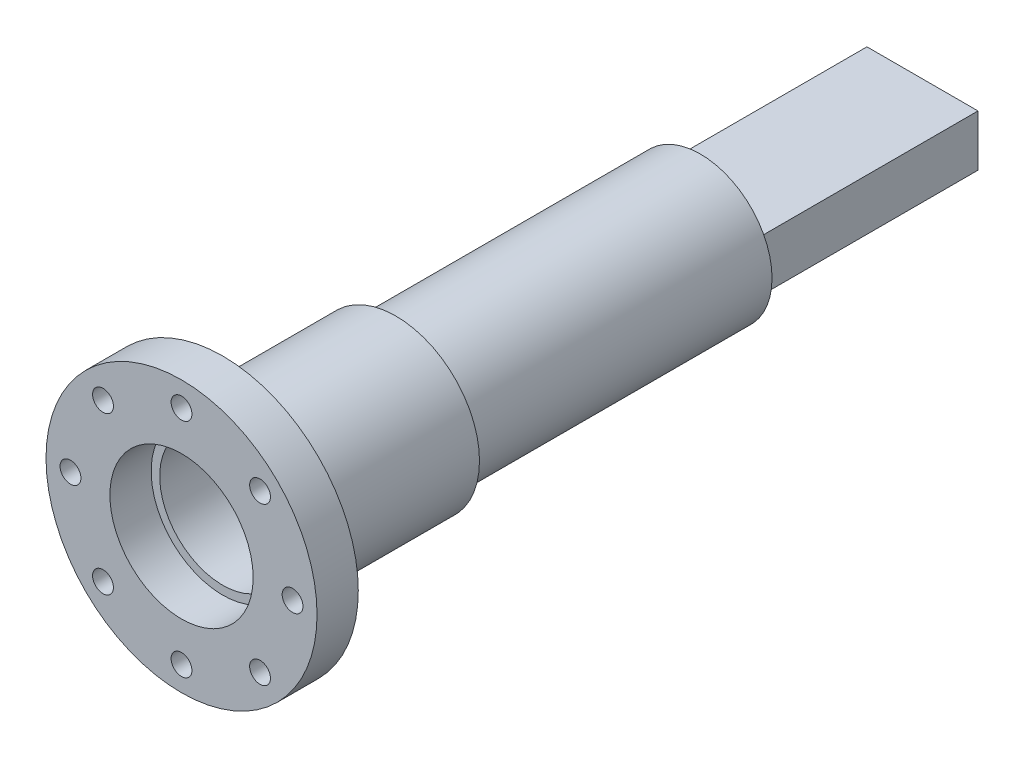
ISO-10303-21;
HEADER;
FILE_DESCRIPTION(('STEP AP214'),'2;1');
FILE_NAME('part.step','',(''),(''),'','','');
FILE_SCHEMA(('AUTOMOTIVE_DESIGN { 1 0 10303 214 1 1 1 1 }'));
ENDSEC;
DATA;
#1=APPLICATION_CONTEXT('core data for automotive mechanical design processes');
#2=APPLICATION_PROTOCOL_DEFINITION('international standard','automotive_design',2000,#1);
#3=PRODUCT_CONTEXT('',#1,'mechanical');
#4=PRODUCT('Part','Part','',(#3));
#5=PRODUCT_RELATED_PRODUCT_CATEGORY('part','',(#4));
#6=PRODUCT_DEFINITION_FORMATION('','',#4);
#7=PRODUCT_DEFINITION_CONTEXT('part definition',#1,'design');
#8=PRODUCT_DEFINITION('design','',#6,#7);
#9=PRODUCT_DEFINITION_SHAPE('','',#8);
#10=(LENGTH_UNIT() NAMED_UNIT(*) SI_UNIT(.MILLI.,.METRE.));
#11=(NAMED_UNIT(*) PLANE_ANGLE_UNIT() SI_UNIT($,.RADIAN.));
#12=(NAMED_UNIT(*) SI_UNIT($,.STERADIAN.) SOLID_ANGLE_UNIT());
#13=UNCERTAINTY_MEASURE_WITH_UNIT(LENGTH_MEASURE(1.E-05),#10,'distance_accuracy_value','');
#14=(GEOMETRIC_REPRESENTATION_CONTEXT(3) GLOBAL_UNCERTAINTY_ASSIGNED_CONTEXT((#13)) GLOBAL_UNIT_ASSIGNED_CONTEXT((#10,
#11,#12)) REPRESENTATION_CONTEXT('',''));
#15=CARTESIAN_POINT('',(0.,0.,0.));
#16=DIRECTION('',(0.,0.,1.));
#17=DIRECTION('',(1.,0.,0.));
#18=AXIS2_PLACEMENT_3D('',#15,#16,#17);
#19=CARTESIAN_POINT('',(0.,0.,217.27177272));
#20=DIRECTION('',(0.,0.,1.));
#21=DIRECTION('',(1.,0.,0.));
#22=AXIS2_PLACEMENT_3D('',#19,#20,#21);
#23=PLANE('',#22);
#24=CARTESIAN_POINT('',(-46.5000340000002,1.53523027623947E-13,217.27177272));
#25=DIRECTION('',(0.,0.,1.));
#26=DIRECTION('',(1.,0.,0.));
#27=AXIS2_PLACEMENT_3D('',#24,#25,#26);
#28=CIRCLE('',#27,4.36250097915163);
#29=CARTESIAN_POINT('',(-42.1375330208485,1.53523027623947E-13,217.27177272));
#30=VERTEX_POINT('',#29);
#31=EDGE_CURVE('E118',#30,#30,#28,.T.);
#32=ORIENTED_EDGE('',*,*,#31,.F.);
#33=EDGE_LOOP('',(#32));
#34=FACE_BOUND('',#33,.T.);
#35=CARTESIAN_POINT('',(-3.22457120133702E-13,-46.500034,217.27177272));
#36=DIRECTION('',(0.,0.,1.));
#37=DIRECTION('',(1.,0.,0.));
#38=AXIS2_PLACEMENT_3D('',#35,#36,#37);
#39=CIRCLE('',#38,4.36250097915163);
#40=CARTESIAN_POINT('',(4.36250097915131,-46.500034,217.27177272));
#41=VERTEX_POINT('',#40);
#42=EDGE_CURVE('E106',#41,#41,#39,.T.);
#43=ORIENTED_EDGE('',*,*,#42,.F.);
#44=EDGE_LOOP('',(#43));
#45=FACE_BOUND('',#44,.T.);
#46=CARTESIAN_POINT('',(46.5000339999998,-1.59160878920872E-13,217.27177272));
#47=DIRECTION('',(0.,0.,1.));
#48=DIRECTION('',(1.,0.,0.));
#49=AXIS2_PLACEMENT_3D('',#46,#47,#48);
#50=CIRCLE('',#49,4.36250097915163);
#51=CARTESIAN_POINT('',(50.8625349791515,-1.59160878920872E-13,217.27177272));
#52=VERTEX_POINT('',#51);
#53=EDGE_CURVE('E94',#52,#52,#50,.T.);
#54=ORIENTED_EDGE('',*,*,#53,.F.);
#55=EDGE_LOOP('',(#54));
#56=FACE_BOUND('',#55,.T.);
#57=CARTESIAN_POINT('',(0.,0.,217.27177272));
#58=DIRECTION('',(0.,0.,1.));
#59=DIRECTION('',(1.,0.,0.));
#60=AXIS2_PLACEMENT_3D('',#57,#58,#59);
#61=CIRCLE('',#60,29.99994);
#62=CARTESIAN_POINT('',(29.99994,0.,217.27177272));
#63=VERTEX_POINT('',#62);
#64=EDGE_CURVE('E82',#63,#63,#61,.T.);
#65=ORIENTED_EDGE('',*,*,#64,.F.);
#66=EDGE_LOOP('',(#65));
#67=FACE_BOUND('',#66,.T.);
#68=CARTESIAN_POINT('',(0.,0.,217.27177272));
#69=DIRECTION('',(0.,0.,1.));
#70=DIRECTION('',(1.,0.,0.));
#71=AXIS2_PLACEMENT_3D('',#68,#69,#70);
#72=CIRCLE('',#71,56.74999953);
#73=CARTESIAN_POINT('',(56.74999953,0.,217.27177272));
#74=VERTEX_POINT('',#73);
#75=EDGE_CURVE('E68',#74,#74,#72,.T.);
#76=ORIENTED_EDGE('',*,*,#75,.T.);
#77=EDGE_LOOP('',(#76));
#78=FACE_BOUND('',#77,.T.);
#79=CARTESIAN_POINT('',(0.,46.500034,217.27177272));
#80=DIRECTION('',(0.,0.,1.));
#81=DIRECTION('',(1.,0.,0.));
#82=AXIS2_PLACEMENT_3D('',#79,#80,#81);
#83=CIRCLE('',#82,4.36250097915163);
#84=CARTESIAN_POINT('',(4.36250097915163,46.500034,217.27177272));
#85=VERTEX_POINT('',#84);
#86=EDGE_CURVE('E77',#85,#85,#83,.T.);
#87=ORIENTED_EDGE('',*,*,#86,.F.);
#88=EDGE_LOOP('',(#87));
#89=FACE_BOUND('',#88,.T.);
#90=CARTESIAN_POINT('',(32.880489366805,32.8804893668049,217.27177272));
#91=DIRECTION('',(0.,0.,1.));
#92=DIRECTION('',(1.,0.,0.));
#93=AXIS2_PLACEMENT_3D('',#90,#91,#92);
#94=CIRCLE('',#93,4.36250097915163);
#95=CARTESIAN_POINT('',(37.2429903459566,32.8804893668049,217.27177272));
#96=VERTEX_POINT('',#95);
#97=EDGE_CURVE('E88',#96,#96,#94,.T.);
#98=ORIENTED_EDGE('',*,*,#97,.F.);
#99=EDGE_LOOP('',(#98));
#100=FACE_BOUND('',#99,.T.);
#101=CARTESIAN_POINT('',(32.8804893668047,-32.8804893668051,217.27177272));
#102=DIRECTION('',(0.,0.,1.));
#103=DIRECTION('',(1.,0.,0.));
#104=AXIS2_PLACEMENT_3D('',#101,#102,#103);
#105=CIRCLE('',#104,4.36250097915163);
#106=CARTESIAN_POINT('',(37.2429903459564,-32.8804893668051,217.27177272));
#107=VERTEX_POINT('',#106);
#108=EDGE_CURVE('E100',#107,#107,#105,.T.);
#109=ORIENTED_EDGE('',*,*,#108,.F.);
#110=EDGE_LOOP('',(#109));
#111=FACE_BOUND('',#110,.T.);
#112=CARTESIAN_POINT('',(-32.8804893668053,-32.8804893668049,217.27177272));
#113=DIRECTION('',(0.,0.,1.));
#114=DIRECTION('',(1.,0.,0.));
#115=AXIS2_PLACEMENT_3D('',#112,#113,#114);
#116=CIRCLE('',#115,4.36250097915163);
#117=CARTESIAN_POINT('',(-28.5179883876537,-32.8804893668049,217.27177272));
#118=VERTEX_POINT('',#117);
#119=EDGE_CURVE('E112',#118,#118,#116,.T.);
#120=ORIENTED_EDGE('',*,*,#119,.F.);
#121=EDGE_LOOP('',(#120));
#122=FACE_BOUND('',#121,.T.);
#123=CARTESIAN_POINT('',(-32.8804893668051,32.8804893668051,217.27177272));
#124=DIRECTION('',(0.,0.,1.));
#125=DIRECTION('',(1.,0.,0.));
#126=AXIS2_PLACEMENT_3D('',#123,#124,#125);
#127=CIRCLE('',#126,4.36250097915163);
#128=CARTESIAN_POINT('',(-28.5179883876534,32.8804893668051,217.27177272));
#129=VERTEX_POINT('',#128);
#130=EDGE_CURVE('E124',#129,#129,#127,.T.);
#131=ORIENTED_EDGE('',*,*,#130,.F.);
#132=EDGE_LOOP('',(#131));
#133=FACE_BOUND('',#132,.T.);
#134=ADVANCED_FACE('F61',(#34,#45,#56,#67,#78,#89,#100,#111,#122,#133),#23,.T.);
#135=CARTESIAN_POINT('',(0.,0.,199.99977272));
#136=DIRECTION('',(0.,0.,1.));
#137=DIRECTION('',(1.,0.,0.));
#138=AXIS2_PLACEMENT_3D('',#135,#136,#137);
#139=PLANE('',#138);
#140=CARTESIAN_POINT('',(0.,0.,199.99977272));
#141=DIRECTION('',(0.,0.,1.));
#142=DIRECTION('',(1.,0.,0.));
#143=AXIS2_PLACEMENT_3D('',#140,#141,#142);
#144=CIRCLE('',#143,35.000057);
#145=CARTESIAN_POINT('',(35.000057,0.,199.99977272));
#146=VERTEX_POINT('',#145);
#147=EDGE_CURVE('E12',#146,#146,#144,.F.);
#148=ORIENTED_EDGE('',*,*,#147,.F.);
#149=EDGE_LOOP('',(#148));
#150=FACE_BOUND('',#149,.T.);
#151=CARTESIAN_POINT('',(0.,0.,199.99977272));
#152=DIRECTION('',(0.,0.,1.));
#153=DIRECTION('',(1.,0.,0.));
#154=AXIS2_PLACEMENT_3D('',#151,#152,#153);
#155=CIRCLE('',#154,56.74999953);
#156=CARTESIAN_POINT('',(56.74999953,0.,199.99977272));
#157=VERTEX_POINT('',#156);
#158=EDGE_CURVE('E72',#157,#157,#155,.T.);
#159=ORIENTED_EDGE('',*,*,#158,.F.);
#160=EDGE_LOOP('',(#159));
#161=FACE_BOUND('',#160,.T.);
#162=CARTESIAN_POINT('',(0.,46.500034,199.99977272));
#163=DIRECTION('',(0.,0.,1.));
#164=DIRECTION('',(1.,0.,0.));
#165=AXIS2_PLACEMENT_3D('',#162,#163,#164);
#166=CIRCLE('',#165,4.36250097915163);
#167=CARTESIAN_POINT('',(4.36250097915163,46.500034,199.99977272));
#168=VERTEX_POINT('',#167);
#169=EDGE_CURVE('E79',#168,#168,#166,.T.);
#170=ORIENTED_EDGE('',*,*,#169,.T.);
#171=EDGE_LOOP('',(#170));
#172=FACE_BOUND('',#171,.T.);
#173=CARTESIAN_POINT('',(32.880489366805,32.8804893668049,199.99977272));
#174=DIRECTION('',(0.,0.,1.));
#175=DIRECTION('',(1.,0.,0.));
#176=AXIS2_PLACEMENT_3D('',#173,#174,#175);
#177=CIRCLE('',#176,4.36250097915163);
#178=CARTESIAN_POINT('',(37.2429903459566,32.8804893668049,199.99977272));
#179=VERTEX_POINT('',#178);
#180=EDGE_CURVE('E91',#179,#179,#177,.T.);
#181=ORIENTED_EDGE('',*,*,#180,.T.);
#182=EDGE_LOOP('',(#181));
#183=FACE_BOUND('',#182,.T.);
#184=CARTESIAN_POINT('',(46.5000339999998,-1.59160878920872E-13,199.99977272));
#185=DIRECTION('',(0.,0.,1.));
#186=DIRECTION('',(1.,0.,0.));
#187=AXIS2_PLACEMENT_3D('',#184,#185,#186);
#188=CIRCLE('',#187,4.36250097915163);
#189=CARTESIAN_POINT('',(50.8625349791515,-1.59160878920872E-13,199.99977272));
#190=VERTEX_POINT('',#189);
#191=EDGE_CURVE('E97',#190,#190,#188,.T.);
#192=ORIENTED_EDGE('',*,*,#191,.T.);
#193=EDGE_LOOP('',(#192));
#194=FACE_BOUND('',#193,.T.);
#195=CARTESIAN_POINT('',(32.8804893668047,-32.8804893668051,199.99977272));
#196=DIRECTION('',(0.,0.,1.));
#197=DIRECTION('',(1.,0.,0.));
#198=AXIS2_PLACEMENT_3D('',#195,#196,#197);
#199=CIRCLE('',#198,4.36250097915163);
#200=CARTESIAN_POINT('',(37.2429903459564,-32.8804893668051,199.99977272));
#201=VERTEX_POINT('',#200);
#202=EDGE_CURVE('E103',#201,#201,#199,.T.);
#203=ORIENTED_EDGE('',*,*,#202,.T.);
#204=EDGE_LOOP('',(#203));
#205=FACE_BOUND('',#204,.T.);
#206=CARTESIAN_POINT('',(-3.22457120133702E-13,-46.500034,199.99977272));
#207=DIRECTION('',(0.,0.,1.));
#208=DIRECTION('',(1.,0.,0.));
#209=AXIS2_PLACEMENT_3D('',#206,#207,#208);
#210=CIRCLE('',#209,4.36250097915163);
#211=CARTESIAN_POINT('',(4.36250097915131,-46.500034,199.99977272));
#212=VERTEX_POINT('',#211);
#213=EDGE_CURVE('E109',#212,#212,#210,.T.);
#214=ORIENTED_EDGE('',*,*,#213,.T.);
#215=EDGE_LOOP('',(#214));
#216=FACE_BOUND('',#215,.T.);
#217=CARTESIAN_POINT('',(-32.8804893668053,-32.8804893668049,199.99977272));
#218=DIRECTION('',(0.,0.,1.));
#219=DIRECTION('',(1.,0.,0.));
#220=AXIS2_PLACEMENT_3D('',#217,#218,#219);
#221=CIRCLE('',#220,4.36250097915163);
#222=CARTESIAN_POINT('',(-28.5179883876537,-32.8804893668049,199.99977272));
#223=VERTEX_POINT('',#222);
#224=EDGE_CURVE('E115',#223,#223,#221,.T.);
#225=ORIENTED_EDGE('',*,*,#224,.T.);
#226=EDGE_LOOP('',(#225));
#227=FACE_BOUND('',#226,.T.);
#228=CARTESIAN_POINT('',(-46.5000340000002,1.53523027623947E-13,199.99977272));
#229=DIRECTION('',(0.,0.,1.));
#230=DIRECTION('',(1.,0.,0.));
#231=AXIS2_PLACEMENT_3D('',#228,#229,#230);
#232=CIRCLE('',#231,4.36250097915163);
#233=CARTESIAN_POINT('',(-42.1375330208485,1.53523027623947E-13,199.99977272));
#234=VERTEX_POINT('',#233);
#235=EDGE_CURVE('E121',#234,#234,#232,.T.);
#236=ORIENTED_EDGE('',*,*,#235,.T.);
#237=EDGE_LOOP('',(#236));
#238=FACE_BOUND('',#237,.T.);
#239=CARTESIAN_POINT('',(-32.8804893668051,32.8804893668051,199.99977272));
#240=DIRECTION('',(0.,0.,1.));
#241=DIRECTION('',(1.,0.,0.));
#242=AXIS2_PLACEMENT_3D('',#239,#240,#241);
#243=CIRCLE('',#242,4.36250097915163);
#244=CARTESIAN_POINT('',(-28.5179883876534,32.8804893668051,199.99977272));
#245=VERTEX_POINT('',#244);
#246=EDGE_CURVE('E127',#245,#245,#243,.T.);
#247=ORIENTED_EDGE('',*,*,#246,.T.);
#248=EDGE_LOOP('',(#247));
#249=FACE_BOUND('',#248,.T.);
#250=ADVANCED_FACE('F161',(#150,#161,#172,#183,#194,#205,#216,#227,#238,#249),#139,.F.);
#251=CARTESIAN_POINT('',(0.,0.,217.27177272));
#252=DIRECTION('',(0.,0.,-1.));
#253=DIRECTION('',(-1.,0.,0.));
#254=AXIS2_PLACEMENT_3D('',#251,#252,#253);
#255=CYLINDRICAL_SURFACE('',#254,56.74999953);
#256=ORIENTED_EDGE('',*,*,#75,.F.);
#257=EDGE_LOOP('',(#256));
#258=FACE_BOUND('',#257,.T.);
#259=ORIENTED_EDGE('',*,*,#158,.T.);
#260=EDGE_LOOP('',(#259));
#261=FACE_BOUND('',#260,.T.);
#262=ADVANCED_FACE('F63',(#258,#261),#255,.T.);
#263=CARTESIAN_POINT('',(0.,46.500034,217.27177272));
#264=DIRECTION('',(0.,0.,-1.));
#265=DIRECTION('',(-1.,0.,0.));
#266=AXIS2_PLACEMENT_3D('',#263,#264,#265);
#267=CYLINDRICAL_SURFACE('',#266,4.36250097915163);
#268=ORIENTED_EDGE('',*,*,#86,.T.);
#269=EDGE_LOOP('',(#268));
#270=FACE_BOUND('',#269,.T.);
#271=ORIENTED_EDGE('',*,*,#169,.F.);
#272=EDGE_LOOP('',(#271));
#273=FACE_BOUND('',#272,.T.);
#274=ADVANCED_FACE('F172',(#270,#273),#267,.F.);
#275=CARTESIAN_POINT('',(0.,0.,217.27177272));
#276=DIRECTION('',(0.,0.,-1.));
#277=DIRECTION('',(-1.,0.,0.));
#278=AXIS2_PLACEMENT_3D('',#275,#276,#277);
#279=CYLINDRICAL_SURFACE('',#278,29.99994);
#280=ORIENTED_EDGE('',*,*,#64,.T.);
#281=EDGE_LOOP('',(#280));
#282=FACE_BOUND('',#281,.T.);
#283=CARTESIAN_POINT('',(0.,0.,199.99977272));
#284=DIRECTION('',(0.,0.,1.));
#285=DIRECTION('',(1.,0.,0.));
#286=AXIS2_PLACEMENT_3D('',#283,#284,#285);
#287=CIRCLE('',#286,29.99994);
#288=CARTESIAN_POINT('',(29.99994,0.,199.99977272));
#289=VERTEX_POINT('',#288);
#290=EDGE_CURVE('E85',#289,#289,#287,.T.);
#291=ORIENTED_EDGE('',*,*,#290,.F.);
#292=EDGE_LOOP('',(#291));
#293=FACE_BOUND('',#292,.T.);
#294=ADVANCED_FACE('F175',(#282,#293),#279,.F.);
#295=CARTESIAN_POINT('',(32.880489366805,32.8804893668049,217.27177272));
#296=DIRECTION('',(0.,0.,-1.));
#297=DIRECTION('',(-1.,0.,0.));
#298=AXIS2_PLACEMENT_3D('',#295,#296,#297);
#299=CYLINDRICAL_SURFACE('',#298,4.36250097915163);
#300=ORIENTED_EDGE('',*,*,#97,.T.);
#301=EDGE_LOOP('',(#300));
#302=FACE_BOUND('',#301,.T.);
#303=ORIENTED_EDGE('',*,*,#180,.F.);
#304=EDGE_LOOP('',(#303));
#305=FACE_BOUND('',#304,.T.);
#306=ADVANCED_FACE('F179',(#302,#305),#299,.F.);
#307=CARTESIAN_POINT('',(46.5000339999998,-1.59160878920872E-13,217.27177272));
#308=DIRECTION('',(0.,0.,-1.));
#309=DIRECTION('',(-1.,0.,0.));
#310=AXIS2_PLACEMENT_3D('',#307,#308,#309);
#311=CYLINDRICAL_SURFACE('',#310,4.36250097915163);
#312=ORIENTED_EDGE('',*,*,#53,.T.);
#313=EDGE_LOOP('',(#312));
#314=FACE_BOUND('',#313,.T.);
#315=ORIENTED_EDGE('',*,*,#191,.F.);
#316=EDGE_LOOP('',(#315));
#317=FACE_BOUND('',#316,.T.);
#318=ADVANCED_FACE('F183',(#314,#317),#311,.F.);
#319=CARTESIAN_POINT('',(32.8804893668047,-32.8804893668051,217.27177272));
#320=DIRECTION('',(0.,0.,-1.));
#321=DIRECTION('',(-1.,0.,0.));
#322=AXIS2_PLACEMENT_3D('',#319,#320,#321);
#323=CYLINDRICAL_SURFACE('',#322,4.36250097915163);
#324=ORIENTED_EDGE('',*,*,#108,.T.);
#325=EDGE_LOOP('',(#324));
#326=FACE_BOUND('',#325,.T.);
#327=ORIENTED_EDGE('',*,*,#202,.F.);
#328=EDGE_LOOP('',(#327));
#329=FACE_BOUND('',#328,.T.);
#330=ADVANCED_FACE('F187',(#326,#329),#323,.F.);
#331=CARTESIAN_POINT('',(-3.22457120133702E-13,-46.500034,217.27177272));
#332=DIRECTION('',(0.,0.,-1.));
#333=DIRECTION('',(-1.,0.,0.));
#334=AXIS2_PLACEMENT_3D('',#331,#332,#333);
#335=CYLINDRICAL_SURFACE('',#334,4.36250097915163);
#336=ORIENTED_EDGE('',*,*,#42,.T.);
#337=EDGE_LOOP('',(#336));
#338=FACE_BOUND('',#337,.T.);
#339=ORIENTED_EDGE('',*,*,#213,.F.);
#340=EDGE_LOOP('',(#339));
#341=FACE_BOUND('',#340,.T.);
#342=ADVANCED_FACE('F191',(#338,#341),#335,.F.);
#343=CARTESIAN_POINT('',(-32.8804893668053,-32.8804893668049,217.27177272));
#344=DIRECTION('',(0.,0.,-1.));
#345=DIRECTION('',(-1.,0.,0.));
#346=AXIS2_PLACEMENT_3D('',#343,#344,#345);
#347=CYLINDRICAL_SURFACE('',#346,4.36250097915163);
#348=ORIENTED_EDGE('',*,*,#119,.T.);
#349=EDGE_LOOP('',(#348));
#350=FACE_BOUND('',#349,.T.);
#351=ORIENTED_EDGE('',*,*,#224,.F.);
#352=EDGE_LOOP('',(#351));
#353=FACE_BOUND('',#352,.T.);
#354=ADVANCED_FACE('F195',(#350,#353),#347,.F.);
#355=CARTESIAN_POINT('',(-46.5000340000002,1.53523027623947E-13,217.27177272));
#356=DIRECTION('',(0.,0.,-1.));
#357=DIRECTION('',(-1.,0.,0.));
#358=AXIS2_PLACEMENT_3D('',#355,#356,#357);
#359=CYLINDRICAL_SURFACE('',#358,4.36250097915163);
#360=ORIENTED_EDGE('',*,*,#31,.T.);
#361=EDGE_LOOP('',(#360));
#362=FACE_BOUND('',#361,.T.);
#363=ORIENTED_EDGE('',*,*,#235,.F.);
#364=EDGE_LOOP('',(#363));
#365=FACE_BOUND('',#364,.T.);
#366=ADVANCED_FACE('F199',(#362,#365),#359,.F.);
#367=CARTESIAN_POINT('',(-32.8804893668051,32.8804893668051,217.27177272));
#368=DIRECTION('',(0.,0.,-1.));
#369=DIRECTION('',(-1.,0.,0.));
#370=AXIS2_PLACEMENT_3D('',#367,#368,#369);
#371=CYLINDRICAL_SURFACE('',#370,4.36250097915163);
#372=ORIENTED_EDGE('',*,*,#130,.T.);
#373=EDGE_LOOP('',(#372));
#374=FACE_BOUND('',#373,.T.);
#375=ORIENTED_EDGE('',*,*,#246,.F.);
#376=EDGE_LOOP('',(#375));
#377=FACE_BOUND('',#376,.T.);
#378=ADVANCED_FACE('F156',(#374,#377),#371,.F.);
#379=CARTESIAN_POINT('',(0.,0.,199.99977272));
#380=DIRECTION('',(0.,0.,1.));
#381=DIRECTION('',(1.,0.,0.));
#382=AXIS2_PLACEMENT_3D('',#379,#380,#381);
#383=PLANE('',#382);
#384=CARTESIAN_POINT('',(0.,0.,199.99977272));
#385=DIRECTION('',(0.,0.,1.));
#386=DIRECTION('',(1.,0.,0.));
#387=AXIS2_PLACEMENT_3D('',#384,#385,#386);
#388=CIRCLE('',#387,26.416);
#389=CARTESIAN_POINT('',(26.416,0.,199.99977272));
#390=VERTEX_POINT('',#389);
#391=EDGE_CURVE('E130',#390,#390,#388,.T.);
#392=ORIENTED_EDGE('',*,*,#391,.F.);
#393=EDGE_LOOP('',(#392));
#394=FACE_BOUND('',#393,.T.);
#395=ORIENTED_EDGE('',*,*,#290,.T.);
#396=EDGE_LOOP('',(#395));
#397=FACE_BOUND('',#396,.T.);
#398=ADVANCED_FACE('F148',(#394,#397),#383,.T.);
#399=CARTESIAN_POINT('',(0.,0.,298.994883306463));
#400=DIRECTION('',(0.,0.,-1.));
#401=DIRECTION('',(-1.,0.,0.));
#402=AXIS2_PLACEMENT_3D('',#399,#400,#401);
#403=CYLINDRICAL_SURFACE('',#402,35.000057);
#404=ORIENTED_EDGE('',*,*,#147,.T.);
#405=EDGE_LOOP('',(#404));
#406=FACE_BOUND('',#405,.T.);
#407=CARTESIAN_POINT('',(0.,0.,127.4998212));
#408=DIRECTION('',(0.,0.,1.));
#409=DIRECTION('',(1.,0.,0.));
#410=AXIS2_PLACEMENT_3D('',#407,#408,#409);
#411=CIRCLE('',#410,35.000057);
#412=CARTESIAN_POINT('',(35.000057,0.,127.4998212));
#413=VERTEX_POINT('',#412);
#414=EDGE_CURVE('E135',#413,#413,#411,.F.);
#415=ORIENTED_EDGE('',*,*,#414,.F.);
#416=EDGE_LOOP('',(#415));
#417=FACE_BOUND('',#416,.T.);
#418=ADVANCED_FACE('F145',(#406,#417),#403,.T.);
#419=CARTESIAN_POINT('',(0.,0.,298.994883306463));
#420=DIRECTION('',(0.,0.,-1.));
#421=DIRECTION('',(-1.,0.,0.));
#422=AXIS2_PLACEMENT_3D('',#419,#420,#421);
#423=CYLINDRICAL_SURFACE('',#422,26.416);
#424=ORIENTED_EDGE('',*,*,#391,.T.);
#425=EDGE_LOOP('',(#424));
#426=FACE_BOUND('',#425,.T.);
#427=CARTESIAN_POINT('',(0.,0.,127.4998212));
#428=DIRECTION('',(0.,0.,1.));
#429=DIRECTION('',(1.,0.,0.));
#430=AXIS2_PLACEMENT_3D('',#427,#428,#429);
#431=CIRCLE('',#430,26.416);
#432=CARTESIAN_POINT('',(26.416,0.,127.4998212));
#433=VERTEX_POINT('',#432);
#434=EDGE_CURVE('E136',#433,#433,#431,.F.);
#435=ORIENTED_EDGE('',*,*,#434,.T.);
#436=EDGE_LOOP('',(#435));
#437=FACE_BOUND('',#436,.T.);
#438=ADVANCED_FACE('F147',(#426,#437),#423,.F.);
#439=CARTESIAN_POINT('',(0.,0.,127.4998212));
#440=DIRECTION('',(0.,0.,1.));
#441=DIRECTION('',(1.,0.,0.));
#442=AXIS2_PLACEMENT_3D('',#439,#440,#441);
#443=PLANE('',#442);
#444=ORIENTED_EDGE('',*,*,#414,.T.);
#445=EDGE_LOOP('',(#444));
#446=FACE_BOUND('',#445,.T.);
#447=ORIENTED_EDGE('',*,*,#434,.F.);
#448=EDGE_LOOP('',(#447));
#449=FACE_BOUND('',#448,.T.);
#450=ADVANCED_FACE('F142',(#446,#449),#443,.F.);
#451=CLOSED_SHELL('',(#134,#250,#262,#274,#294,#306,#318,#330,#342,#354,#366,#378,#398,#418,
#438,#450));
#452=MANIFOLD_SOLID_BREP('B2',#451);
#453=CARTESIAN_POINT('',(-23.2500043,-10.75000009,-93.000068));
#454=DIRECTION('',(1.,0.,0.));
#455=DIRECTION('',(0.,0.,-1.));
#456=AXIS2_PLACEMENT_3D('',#453,#454,#455);
#457=PLANE('',#456);
#458=DIRECTION('',(0.,1.,0.));
#459=VECTOR('',#458,1.);
#460=CARTESIAN_POINT('',(-23.2500043,-10.75000009,0.));
#461=LINE('',#460,#459);
#462=CARTESIAN_POINT('',(-23.2500043,-10.75000009,0.));
#463=VERTEX_POINT('',#462);
#464=CARTESIAN_POINT('',(-23.2500043,10.75000009,0.));
#465=VERTEX_POINT('',#464);
#466=EDGE_CURVE('E502',#463,#465,#461,.T.);
#467=ORIENTED_EDGE('',*,*,#466,.T.);
#468=DIRECTION('',(0.,0.,1.));
#469=VECTOR('',#468,1.);
#470=CARTESIAN_POINT('',(-23.2500043,10.75000009,-93.000068));
#471=LINE('',#470,#469);
#472=CARTESIAN_POINT('',(-23.2500043,10.75000009,-93.000068));
#473=VERTEX_POINT('',#472);
#474=EDGE_CURVE('E550',#473,#465,#471,.T.);
#475=ORIENTED_EDGE('',*,*,#474,.F.);
#476=DIRECTION('',(0.,1.,0.));
#477=VECTOR('',#476,1.);
#478=CARTESIAN_POINT('',(-23.2500043,-10.75000009,-93.000068));
#479=LINE('',#478,#477);
#480=CARTESIAN_POINT('',(-23.2500043,-10.75000009,-93.000068));
#481=VERTEX_POINT('',#480);
#482=EDGE_CURVE('E529',#481,#473,#479,.T.);
#483=ORIENTED_EDGE('',*,*,#482,.F.);
#484=DIRECTION('',(0.,0.,1.));
#485=VECTOR('',#484,1.);
#486=CARTESIAN_POINT('',(-23.2500043,-10.75000009,-93.000068));
#487=LINE('',#486,#485);
#488=EDGE_CURVE('E435',#481,#463,#487,.T.);
#489=ORIENTED_EDGE('',*,*,#488,.T.);
#490=EDGE_LOOP('',(#467,#475,#483,#489));
#491=FACE_BOUND('',#490,.T.);
#492=ADVANCED_FACE('F374',(#491),#457,.F.);
#493=CARTESIAN_POINT('',(-23.2500043,10.75000009,-93.000068));
#494=DIRECTION('',(0.,-1.,0.));
#495=DIRECTION('',(0.,0.,-1.));
#496=AXIS2_PLACEMENT_3D('',#493,#494,#495);
#497=PLANE('',#496);
#498=DIRECTION('',(1.,0.,0.));
#499=VECTOR('',#498,1.);
#500=CARTESIAN_POINT('',(-23.2500043,10.75000009,0.));
#501=LINE('',#500,#499);
#502=CARTESIAN_POINT('',(23.2500043,10.75000009,0.));
#503=VERTEX_POINT('',#502);
#504=EDGE_CURVE('E538',#465,#503,#501,.T.);
#505=ORIENTED_EDGE('',*,*,#504,.T.);
#506=DIRECTION('',(0.,0.,1.));
#507=VECTOR('',#506,1.);
#508=CARTESIAN_POINT('',(23.2500043,10.75000009,-93.000068));
#509=LINE('',#508,#507);
#510=CARTESIAN_POINT('',(23.2500043,10.75000009,-93.000068));
#511=VERTEX_POINT('',#510);
#512=EDGE_CURVE('E451',#511,#503,#509,.T.);
#513=ORIENTED_EDGE('',*,*,#512,.F.);
#514=DIRECTION('',(1.,0.,0.));
#515=VECTOR('',#514,1.);
#516=CARTESIAN_POINT('',(-23.2500043,10.75000009,-93.000068));
#517=LINE('',#516,#515);
#518=EDGE_CURVE('E460',#473,#511,#517,.T.);
#519=ORIENTED_EDGE('',*,*,#518,.F.);
#520=ORIENTED_EDGE('',*,*,#474,.T.);
#521=EDGE_LOOP('',(#505,#513,#519,#520));
#522=FACE_BOUND('',#521,.T.);
#523=ADVANCED_FACE('F608',(#522),#497,.F.);
#524=CARTESIAN_POINT('',(23.2500043,-10.75000009,-93.000068));
#525=DIRECTION('',(1.,0.,0.));
#526=DIRECTION('',(0.,0.,-1.));
#527=AXIS2_PLACEMENT_3D('',#524,#525,#526);
#528=PLANE('',#527);
#529=DIRECTION('',(0.,1.,0.));
#530=VECTOR('',#529,1.);
#531=CARTESIAN_POINT('',(23.2500043,-10.75000009,0.));
#532=LINE('',#531,#530);
#533=CARTESIAN_POINT('',(23.2500043,-10.75000009,0.));
#534=VERTEX_POINT('',#533);
#535=EDGE_CURVE('E540',#534,#503,#532,.T.);
#536=ORIENTED_EDGE('',*,*,#535,.F.);
#537=DIRECTION('',(0.,0.,1.));
#538=VECTOR('',#537,1.);
#539=CARTESIAN_POINT('',(23.2500043,-10.75000009,-93.000068));
#540=LINE('',#539,#538);
#541=CARTESIAN_POINT('',(23.2500043,-10.75000009,-93.000068));
#542=VERTEX_POINT('',#541);
#543=EDGE_CURVE('E546',#542,#534,#540,.T.);
#544=ORIENTED_EDGE('',*,*,#543,.F.);
#545=DIRECTION('',(0.,1.,0.));
#546=VECTOR('',#545,1.);
#547=CARTESIAN_POINT('',(23.2500043,-10.75000009,-93.000068));
#548=LINE('',#547,#546);
#549=EDGE_CURVE('E533',#542,#511,#548,.T.);
#550=ORIENTED_EDGE('',*,*,#549,.T.);
#551=ORIENTED_EDGE('',*,*,#512,.T.);
#552=EDGE_LOOP('',(#536,#544,#550,#551));
#553=FACE_BOUND('',#552,.T.);
#554=ADVANCED_FACE('F611',(#553),#528,.T.);
#555=CARTESIAN_POINT('',(-23.2500043,-10.75000009,-93.000068));
#556=DIRECTION('',(0.,-1.,0.));
#557=DIRECTION('',(0.,0.,-1.));
#558=AXIS2_PLACEMENT_3D('',#555,#556,#557);
#559=PLANE('',#558);
#560=DIRECTION('',(1.,0.,0.));
#561=VECTOR('',#560,1.);
#562=CARTESIAN_POINT('',(-23.2500043,-10.75000009,0.));
#563=LINE('',#562,#561);
#564=EDGE_CURVE('E531',#463,#534,#563,.T.);
#565=ORIENTED_EDGE('',*,*,#564,.F.);
#566=ORIENTED_EDGE('',*,*,#488,.F.);
#567=DIRECTION('',(1.,0.,0.));
#568=VECTOR('',#567,1.);
#569=CARTESIAN_POINT('',(-23.2500043,-10.75000009,-93.000068));
#570=LINE('',#569,#568);
#571=EDGE_CURVE('E535',#481,#542,#570,.T.);
#572=ORIENTED_EDGE('',*,*,#571,.T.);
#573=ORIENTED_EDGE('',*,*,#543,.T.);
#574=EDGE_LOOP('',(#565,#566,#572,#573));
#575=FACE_BOUND('',#574,.T.);
#576=ADVANCED_FACE('F614',(#575),#559,.T.);
#577=CARTESIAN_POINT('',(0.,0.,-93.000068));
#578=DIRECTION('',(0.,0.,-1.));
#579=DIRECTION('',(-1.,0.,0.));
#580=AXIS2_PLACEMENT_3D('',#577,#578,#579);
#581=PLANE('',#580);
#582=ORIENTED_EDGE('',*,*,#482,.T.);
#583=ORIENTED_EDGE('',*,*,#518,.T.);
#584=ORIENTED_EDGE('',*,*,#549,.F.);
#585=ORIENTED_EDGE('',*,*,#571,.F.);
#586=EDGE_LOOP('',(#582,#583,#584,#585));
#587=FACE_BOUND('',#586,.T.);
#588=ADVANCED_FACE('F617',(#587),#581,.T.);
#589=CARTESIAN_POINT('',(0.,0.,0.));
#590=DIRECTION('',(0.,0.,1.));
#591=DIRECTION('',(1.,0.,0.));
#592=AXIS2_PLACEMENT_3D('',#589,#590,#591);
#593=PLANE('',#592);
#594=CARTESIAN_POINT('',(0.,0.,0.));
#595=DIRECTION('',(0.,0.,1.));
#596=DIRECTION('',(1.,0.,0.));
#597=AXIS2_PLACEMENT_3D('',#594,#595,#596);
#598=CIRCLE('',#597,29.99994);
#599=CARTESIAN_POINT('',(29.99994,0.,0.));
#600=VERTEX_POINT('',#599);
#601=EDGE_CURVE('E662',#600,#600,#598,.T.);
#602=ORIENTED_EDGE('',*,*,#601,.F.);
#603=EDGE_LOOP('',(#602));
#604=FACE_BOUND('',#603,.T.);
#605=ORIENTED_EDGE('',*,*,#504,.F.);
#606=ORIENTED_EDGE('',*,*,#466,.F.);
#607=ORIENTED_EDGE('',*,*,#564,.T.);
#608=ORIENTED_EDGE('',*,*,#535,.T.);
#609=EDGE_LOOP('',(#605,#606,#607,#608));
#610=FACE_BOUND('',#609,.T.);
#611=ADVANCED_FACE('F625',(#604,#610),#593,.F.);
#612=CARTESIAN_POINT('',(0.,0.,212.352465236758));
#613=DIRECTION('',(0.,0.,-1.));
#614=DIRECTION('',(-1.,0.,0.));
#615=AXIS2_PLACEMENT_3D('',#612,#613,#614);
#616=CYLINDRICAL_SURFACE('',#615,29.99994);
#617=ORIENTED_EDGE('',*,*,#601,.T.);
#618=EDGE_LOOP('',(#617));
#619=FACE_BOUND('',#618,.T.);
#620=CARTESIAN_POINT('',(0.,0.,127.4998212));
#621=DIRECTION('',(0.,0.,1.));
#622=DIRECTION('',(1.,0.,0.));
#623=AXIS2_PLACEMENT_3D('',#620,#621,#622);
#624=CIRCLE('',#623,29.99994);
#625=CARTESIAN_POINT('',(29.99994,0.,127.4998212));
#626=VERTEX_POINT('',#625);
#627=EDGE_CURVE('E518',#626,#626,#624,.T.);
#628=ORIENTED_EDGE('',*,*,#627,.F.);
#629=EDGE_LOOP('',(#628));
#630=FACE_BOUND('',#629,.T.);
#631=ADVANCED_FACE('F629',(#619,#630),#616,.T.);
#632=CARTESIAN_POINT('',(0.,0.,212.352465236758));
#633=DIRECTION('',(0.,0.,-1.));
#634=DIRECTION('',(-1.,0.,0.));
#635=AXIS2_PLACEMENT_3D('',#632,#633,#634);
#636=CYLINDRICAL_SURFACE('',#635,26.416);
#637=CARTESIAN_POINT('',(0.,0.,0.762000000000013));
#638=DIRECTION('',(0.,0.,1.));
#639=DIRECTION('',(1.,0.,0.));
#640=AXIS2_PLACEMENT_3D('',#637,#638,#639);
#641=CIRCLE('',#640,26.416);
#642=CARTESIAN_POINT('',(26.416,0.,0.762000000000013));
#643=VERTEX_POINT('',#642);
#644=EDGE_CURVE('E59',#643,#643,#641,.F.);
#645=ORIENTED_EDGE('',*,*,#644,.T.);
#646=EDGE_LOOP('',(#645));
#647=FACE_BOUND('',#646,.T.);
#648=CARTESIAN_POINT('',(0.,0.,127.4998212));
#649=DIRECTION('',(0.,0.,1.));
#650=DIRECTION('',(1.,0.,0.));
#651=AXIS2_PLACEMENT_3D('',#648,#649,#650);
#652=CIRCLE('',#651,26.416);
#653=CARTESIAN_POINT('',(26.416,0.,127.4998212));
#654=VERTEX_POINT('',#653);
#655=EDGE_CURVE('E658',#654,#654,#652,.T.);
#656=ORIENTED_EDGE('',*,*,#655,.T.);
#657=EDGE_LOOP('',(#656));
#658=FACE_BOUND('',#657,.T.);
#659=ADVANCED_FACE('F645',(#647,#658),#636,.F.);
#660=CARTESIAN_POINT('',(0.,0.,127.4998212));
#661=DIRECTION('',(0.,0.,1.));
#662=DIRECTION('',(1.,0.,0.));
#663=AXIS2_PLACEMENT_3D('',#660,#661,#662);
#664=PLANE('',#663);
#665=ORIENTED_EDGE('',*,*,#655,.F.);
#666=EDGE_LOOP('',(#665));
#667=FACE_BOUND('',#666,.T.);
#668=ORIENTED_EDGE('',*,*,#627,.T.);
#669=EDGE_LOOP('',(#668));
#670=FACE_BOUND('',#669,.T.);
#671=ADVANCED_FACE('F621',(#667,#670),#664,.T.);
#672=CARTESIAN_POINT('',(0.,0.,0.));
#673=DIRECTION('',(0.,0.,-1.));
#674=DIRECTION('',(-1.,0.,0.));
#675=AXIS2_PLACEMENT_3D('',#672,#673,#674);
#676=PLANE('',#675);
#677=DIRECTION('',(1.,0.,0.));
#678=VECTOR('',#677,1.);
#679=CARTESIAN_POINT('',(-19.7500113,-7.25000709,0.));
#680=LINE('',#679,#678);
#681=CARTESIAN_POINT('',(-19.7500113,-7.25000709,0.));
#682=VERTEX_POINT('',#681);
#683=CARTESIAN_POINT('',(19.7500113,-7.25000709,0.));
#684=VERTEX_POINT('',#683);
#685=EDGE_CURVE('E495',#682,#684,#680,.T.);
#686=ORIENTED_EDGE('',*,*,#685,.T.);
#687=DIRECTION('',(0.,1.,0.));
#688=VECTOR('',#687,1.);
#689=CARTESIAN_POINT('',(19.7500113,-7.25000709,0.));
#690=LINE('',#689,#688);
#691=CARTESIAN_POINT('',(19.7500113,7.25000709,0.));
#692=VERTEX_POINT('',#691);
#693=EDGE_CURVE('E516',#684,#692,#690,.T.);
#694=ORIENTED_EDGE('',*,*,#693,.T.);
#695=DIRECTION('',(-1.,0.,0.));
#696=VECTOR('',#695,1.);
#697=CARTESIAN_POINT('',(-19.7500113,7.25000709,0.));
#698=LINE('',#697,#696);
#699=CARTESIAN_POINT('',(-19.7500113,7.25000709,0.));
#700=VERTEX_POINT('',#699);
#701=EDGE_CURVE('E501',#692,#700,#698,.T.);
#702=ORIENTED_EDGE('',*,*,#701,.T.);
#703=DIRECTION('',(0.,-1.,0.));
#704=VECTOR('',#703,1.);
#705=CARTESIAN_POINT('',(-19.7500113,-7.25000709,0.));
#706=LINE('',#705,#704);
#707=EDGE_CURVE('E520',#700,#682,#706,.T.);
#708=ORIENTED_EDGE('',*,*,#707,.T.);
#709=EDGE_LOOP('',(#686,#694,#702,#708));
#710=FACE_BOUND('',#709,.T.);
#711=ADVANCED_FACE('F618',(#710),#676,.F.);
#712=CARTESIAN_POINT('',(-19.7500113,-7.25000709,0.762));
#713=DIRECTION('',(1.,0.,0.));
#714=DIRECTION('',(0.,0.,-1.));
#715=AXIS2_PLACEMENT_3D('',#712,#713,#714);
#716=PLANE('',#715);
#717=ORIENTED_EDGE('',*,*,#707,.F.);
#718=DIRECTION('',(0.,0.,-1.));
#719=VECTOR('',#718,1.);
#720=CARTESIAN_POINT('',(-19.7500113,7.25000709,0.762));
#721=LINE('',#720,#719);
#722=CARTESIAN_POINT('',(-19.7500113,7.25000709,0.762));
#723=VERTEX_POINT('',#722);
#724=EDGE_CURVE('E503',#723,#700,#721,.T.);
#725=ORIENTED_EDGE('',*,*,#724,.F.);
#726=DIRECTION('',(0.,-1.,0.));
#727=VECTOR('',#726,1.);
#728=CARTESIAN_POINT('',(-19.7500113,-7.25000709,0.762));
#729=LINE('',#728,#727);
#730=CARTESIAN_POINT('',(-19.7500113,-7.25000709,0.762));
#731=VERTEX_POINT('',#730);
#732=EDGE_CURVE('E509',#723,#731,#729,.T.);
#733=ORIENTED_EDGE('',*,*,#732,.T.);
#734=DIRECTION('',(0.,0.,-1.));
#735=VECTOR('',#734,1.);
#736=CARTESIAN_POINT('',(-19.7500113,-7.25000709,0.762));
#737=LINE('',#736,#735);
#738=EDGE_CURVE('E526',#731,#682,#737,.T.);
#739=ORIENTED_EDGE('',*,*,#738,.T.);
#740=EDGE_LOOP('',(#717,#725,#733,#739));
#741=FACE_BOUND('',#740,.T.);
#742=ADVANCED_FACE('F620',(#741),#716,.T.);
#743=CARTESIAN_POINT('',(-19.7500113,-7.25000709,0.762));
#744=DIRECTION('',(0.,1.,0.));
#745=DIRECTION('',(0.,0.,1.));
#746=AXIS2_PLACEMENT_3D('',#743,#744,#745);
#747=PLANE('',#746);
#748=ORIENTED_EDGE('',*,*,#685,.F.);
#749=ORIENTED_EDGE('',*,*,#738,.F.);
#750=DIRECTION('',(1.,0.,0.));
#751=VECTOR('',#750,1.);
#752=CARTESIAN_POINT('',(-19.7500113,-7.25000709,0.762));
#753=LINE('',#752,#751);
#754=CARTESIAN_POINT('',(19.7500113,-7.25000709,0.762));
#755=VERTEX_POINT('',#754);
#756=EDGE_CURVE('E511',#731,#755,#753,.T.);
#757=ORIENTED_EDGE('',*,*,#756,.T.);
#758=DIRECTION('',(0.,0.,-1.));
#759=VECTOR('',#758,1.);
#760=CARTESIAN_POINT('',(19.7500113,-7.25000709,0.762));
#761=LINE('',#760,#759);
#762=EDGE_CURVE('E390',#755,#684,#761,.T.);
#763=ORIENTED_EDGE('',*,*,#762,.T.);
#764=EDGE_LOOP('',(#748,#749,#757,#763));
#765=FACE_BOUND('',#764,.T.);
#766=ADVANCED_FACE('F635',(#765),#747,.T.);
#767=CARTESIAN_POINT('',(19.7500113,-7.25000709,0.762));
#768=DIRECTION('',(-1.,0.,0.));
#769=DIRECTION('',(0.,0.,1.));
#770=AXIS2_PLACEMENT_3D('',#767,#768,#769);
#771=PLANE('',#770);
#772=ORIENTED_EDGE('',*,*,#693,.F.);
#773=ORIENTED_EDGE('',*,*,#762,.F.);
#774=DIRECTION('',(0.,1.,0.));
#775=VECTOR('',#774,1.);
#776=CARTESIAN_POINT('',(19.7500113,-7.25000709,0.762));
#777=LINE('',#776,#775);
#778=CARTESIAN_POINT('',(19.7500113,7.25000709,0.762));
#779=VERTEX_POINT('',#778);
#780=EDGE_CURVE('E486',#755,#779,#777,.T.);
#781=ORIENTED_EDGE('',*,*,#780,.T.);
#782=DIRECTION('',(0.,0.,-1.));
#783=VECTOR('',#782,1.);
#784=CARTESIAN_POINT('',(19.7500113,7.25000709,0.762));
#785=LINE('',#784,#783);
#786=EDGE_CURVE('E489',#779,#692,#785,.T.);
#787=ORIENTED_EDGE('',*,*,#786,.T.);
#788=EDGE_LOOP('',(#772,#773,#781,#787));
#789=FACE_BOUND('',#788,.T.);
#790=ADVANCED_FACE('F488',(#789),#771,.T.);
#791=CARTESIAN_POINT('',(-19.7500113,7.25000709,0.762));
#792=DIRECTION('',(0.,-1.,0.));
#793=DIRECTION('',(0.,0.,-1.));
#794=AXIS2_PLACEMENT_3D('',#791,#792,#793);
#795=PLANE('',#794);
#796=ORIENTED_EDGE('',*,*,#701,.F.);
#797=ORIENTED_EDGE('',*,*,#786,.F.);
#798=DIRECTION('',(-1.,0.,0.));
#799=VECTOR('',#798,1.);
#800=CARTESIAN_POINT('',(-19.7500113,7.25000709,0.762));
#801=LINE('',#800,#799);
#802=EDGE_CURVE('E494',#779,#723,#801,.T.);
#803=ORIENTED_EDGE('',*,*,#802,.T.);
#804=ORIENTED_EDGE('',*,*,#724,.T.);
#805=EDGE_LOOP('',(#796,#797,#803,#804));
#806=FACE_BOUND('',#805,.T.);
#807=ADVANCED_FACE('F498',(#806),#795,.T.);
#808=CARTESIAN_POINT('',(0.,0.,0.762));
#809=DIRECTION('',(0.,0.,1.));
#810=DIRECTION('',(1.,0.,0.));
#811=AXIS2_PLACEMENT_3D('',#808,#809,#810);
#812=PLANE('',#811);
#813=ORIENTED_EDGE('',*,*,#802,.F.);
#814=ORIENTED_EDGE('',*,*,#780,.F.);
#815=ORIENTED_EDGE('',*,*,#756,.F.);
#816=ORIENTED_EDGE('',*,*,#732,.F.);
#817=EDGE_LOOP('',(#813,#814,#815,#816));
#818=FACE_BOUND('',#817,.T.);
#819=ORIENTED_EDGE('',*,*,#644,.F.);
#820=EDGE_LOOP('',(#819));
#821=FACE_BOUND('',#820,.T.);
#822=ADVANCED_FACE('F506',(#818,#821),#812,.T.);
#823=CLOSED_SHELL('',(#492,#523,#554,#576,#588,#611,#631,#659,#671,#711,#742,#766,#790,#807,#822));
#824=CARTESIAN_POINT('',(-19.7500113,-10.75000009,-93.000068));
#825=DIRECTION('',(1.,0.,0.));
#826=DIRECTION('',(0.,0.,-1.));
#827=AXIS2_PLACEMENT_3D('',#824,#825,#826);
#828=PLANE('',#827);
#829=DIRECTION('',(0.,1.,0.));
#830=VECTOR('',#829,1.);
#831=CARTESIAN_POINT('',(-19.7500113,-10.75000009,-3.49999299999999));
#832=LINE('',#831,#830);
#833=CARTESIAN_POINT('',(-19.7500113,-7.25000709,-3.499993));
#834=VERTEX_POINT('',#833);
#835=CARTESIAN_POINT('',(-19.7500113,7.25000709,-3.499993));
#836=VERTEX_POINT('',#835);
#837=EDGE_CURVE('E552',#834,#836,#832,.T.);
#838=ORIENTED_EDGE('',*,*,#837,.F.);
#839=DIRECTION('',(0.,0.,1.));
#840=VECTOR('',#839,1.);
#841=CARTESIAN_POINT('',(-19.7500113,-7.25000709,-93.000068));
#842=LINE('',#841,#840);
#843=CARTESIAN_POINT('',(-19.7500113,-7.25000709,-89.500075));
#844=VERTEX_POINT('',#843);
#845=EDGE_CURVE('E426',#844,#834,#842,.T.);
#846=ORIENTED_EDGE('',*,*,#845,.F.);
#847=DIRECTION('',(0.,1.,0.));
#848=VECTOR('',#847,1.);
#849=CARTESIAN_POINT('',(-19.7500113,-10.75000009,-89.500075));
#850=LINE('',#849,#848);
#851=CARTESIAN_POINT('',(-19.7500113,7.25000709,-89.500075));
#852=VERTEX_POINT('',#851);
#853=EDGE_CURVE('E559',#844,#852,#850,.T.);
#854=ORIENTED_EDGE('',*,*,#853,.T.);
#855=DIRECTION('',(0.,0.,1.));
#856=VECTOR('',#855,1.);
#857=CARTESIAN_POINT('',(-19.7500113,7.25000709,-93.000068));
#858=LINE('',#857,#856);
#859=EDGE_CURVE('E572',#852,#836,#858,.T.);
#860=ORIENTED_EDGE('',*,*,#859,.T.);
#861=EDGE_LOOP('',(#838,#846,#854,#860));
#862=FACE_BOUND('',#861,.T.);
#863=ADVANCED_FACE('F580',(#862),#828,.T.);
#864=CARTESIAN_POINT('',(-23.2500043,7.25000709,-93.000068));
#865=DIRECTION('',(0.,-1.,0.));
#866=DIRECTION('',(0.,0.,-1.));
#867=AXIS2_PLACEMENT_3D('',#864,#865,#866);
#868=PLANE('',#867);
#869=DIRECTION('',(1.,0.,0.));
#870=VECTOR('',#869,1.);
#871=CARTESIAN_POINT('',(-23.2500043,7.25000709,-3.49999299999999));
#872=LINE('',#871,#870);
#873=CARTESIAN_POINT('',(19.7500113,7.25000709,-3.499993));
#874=VERTEX_POINT('',#873);
#875=EDGE_CURVE('E399',#836,#874,#872,.T.);
#876=ORIENTED_EDGE('',*,*,#875,.F.);
#877=ORIENTED_EDGE('',*,*,#859,.F.);
#878=DIRECTION('',(1.,0.,0.));
#879=VECTOR('',#878,1.);
#880=CARTESIAN_POINT('',(-23.2500043,7.25000709,-89.500075));
#881=LINE('',#880,#879);
#882=CARTESIAN_POINT('',(19.7500113,7.25000709,-89.500075));
#883=VERTEX_POINT('',#882);
#884=EDGE_CURVE('E557',#852,#883,#881,.T.);
#885=ORIENTED_EDGE('',*,*,#884,.T.);
#886=DIRECTION('',(0.,0.,1.));
#887=VECTOR('',#886,1.);
#888=CARTESIAN_POINT('',(19.7500113,7.25000709,-93.000068));
#889=LINE('',#888,#887);
#890=EDGE_CURVE('E567',#883,#874,#889,.T.);
#891=ORIENTED_EDGE('',*,*,#890,.T.);
#892=EDGE_LOOP('',(#876,#877,#885,#891));
#893=FACE_BOUND('',#892,.T.);
#894=ADVANCED_FACE('F582',(#893),#868,.T.);
#895=CARTESIAN_POINT('',(19.7500113,-10.75000009,-93.000068));
#896=DIRECTION('',(1.,0.,0.));
#897=DIRECTION('',(0.,0.,-1.));
#898=AXIS2_PLACEMENT_3D('',#895,#896,#897);
#899=PLANE('',#898);
#900=DIRECTION('',(0.,1.,0.));
#901=VECTOR('',#900,1.);
#902=CARTESIAN_POINT('',(19.7500113,-10.75000009,-3.49999299999999));
#903=LINE('',#902,#901);
#904=CARTESIAN_POINT('',(19.7500113,-7.25000709,-3.499993));
#905=VERTEX_POINT('',#904);
#906=EDGE_CURVE('E383',#905,#874,#903,.T.);
#907=ORIENTED_EDGE('',*,*,#906,.T.);
#908=ORIENTED_EDGE('',*,*,#890,.F.);
#909=DIRECTION('',(0.,1.,0.));
#910=VECTOR('',#909,1.);
#911=CARTESIAN_POINT('',(19.7500113,-10.75000009,-89.500075));
#912=LINE('',#911,#910);
#913=CARTESIAN_POINT('',(19.7500113,-7.25000709,-89.500075));
#914=VERTEX_POINT('',#913);
#915=EDGE_CURVE('E569',#914,#883,#912,.T.);
#916=ORIENTED_EDGE('',*,*,#915,.F.);
#917=DIRECTION('',(0.,0.,1.));
#918=VECTOR('',#917,1.);
#919=CARTESIAN_POINT('',(19.7500113,-7.25000709,-93.000068));
#920=LINE('',#919,#918);
#921=EDGE_CURVE('E562',#914,#905,#920,.T.);
#922=ORIENTED_EDGE('',*,*,#921,.T.);
#923=EDGE_LOOP('',(#907,#908,#916,#922));
#924=FACE_BOUND('',#923,.T.);
#925=ADVANCED_FACE('F587',(#924),#899,.F.);
#926=CARTESIAN_POINT('',(-23.2500043,-7.25000709,-93.000068));
#927=DIRECTION('',(0.,-1.,0.));
#928=DIRECTION('',(0.,0.,-1.));
#929=AXIS2_PLACEMENT_3D('',#926,#927,#928);
#930=PLANE('',#929);
#931=DIRECTION('',(1.,0.,0.));
#932=VECTOR('',#931,1.);
#933=CARTESIAN_POINT('',(-23.2500043,-7.25000709,-3.49999299999999));
#934=LINE('',#933,#932);
#935=EDGE_CURVE('E555',#834,#905,#934,.T.);
#936=ORIENTED_EDGE('',*,*,#935,.T.);
#937=ORIENTED_EDGE('',*,*,#921,.F.);
#938=DIRECTION('',(1.,0.,0.));
#939=VECTOR('',#938,1.);
#940=CARTESIAN_POINT('',(-23.2500043,-7.25000709,-89.500075));
#941=LINE('',#940,#939);
#942=EDGE_CURVE('E564',#844,#914,#941,.T.);
#943=ORIENTED_EDGE('',*,*,#942,.F.);
#944=ORIENTED_EDGE('',*,*,#845,.T.);
#945=EDGE_LOOP('',(#936,#937,#943,#944));
#946=FACE_BOUND('',#945,.T.);
#947=ADVANCED_FACE('F589',(#946),#930,.F.);
#948=CARTESIAN_POINT('',(0.,0.,-89.500075));
#949=DIRECTION('',(0.,0.,-1.));
#950=DIRECTION('',(-1.,0.,0.));
#951=AXIS2_PLACEMENT_3D('',#948,#949,#950);
#952=PLANE('',#951);
#953=ORIENTED_EDGE('',*,*,#853,.F.);
#954=ORIENTED_EDGE('',*,*,#942,.T.);
#955=ORIENTED_EDGE('',*,*,#915,.T.);
#956=ORIENTED_EDGE('',*,*,#884,.F.);
#957=EDGE_LOOP('',(#953,#954,#955,#956));
#958=FACE_BOUND('',#957,.T.);
#959=ADVANCED_FACE('F588',(#958),#952,.F.);
#960=CARTESIAN_POINT('',(0.,0.,-3.499993));
#961=DIRECTION('',(0.,0.,-1.));
#962=DIRECTION('',(-1.,0.,0.));
#963=AXIS2_PLACEMENT_3D('',#960,#961,#962);
#964=PLANE('',#963);
#965=ORIENTED_EDGE('',*,*,#837,.T.);
#966=ORIENTED_EDGE('',*,*,#875,.T.);
#967=ORIENTED_EDGE('',*,*,#906,.F.);
#968=ORIENTED_EDGE('',*,*,#935,.F.);
#969=EDGE_LOOP('',(#965,#966,#967,#968));
#970=FACE_BOUND('',#969,.T.);
#971=ADVANCED_FACE('F376',(#970),#964,.T.);
#972=CLOSED_SHELL('',(#863,#894,#925,#947,#959,#971));
#973=ORIENTED_CLOSED_SHELL('',*,#972,.T.);
#974=BREP_WITH_VOIDS('B7',#823,(#973));
#975=ADVANCED_BREP_SHAPE_REPRESENTATION('',(#18,#452,#974),#14);
#976=SHAPE_DEFINITION_REPRESENTATION(#9,#975);
ENDSEC;
END-ISO-10303-21;
